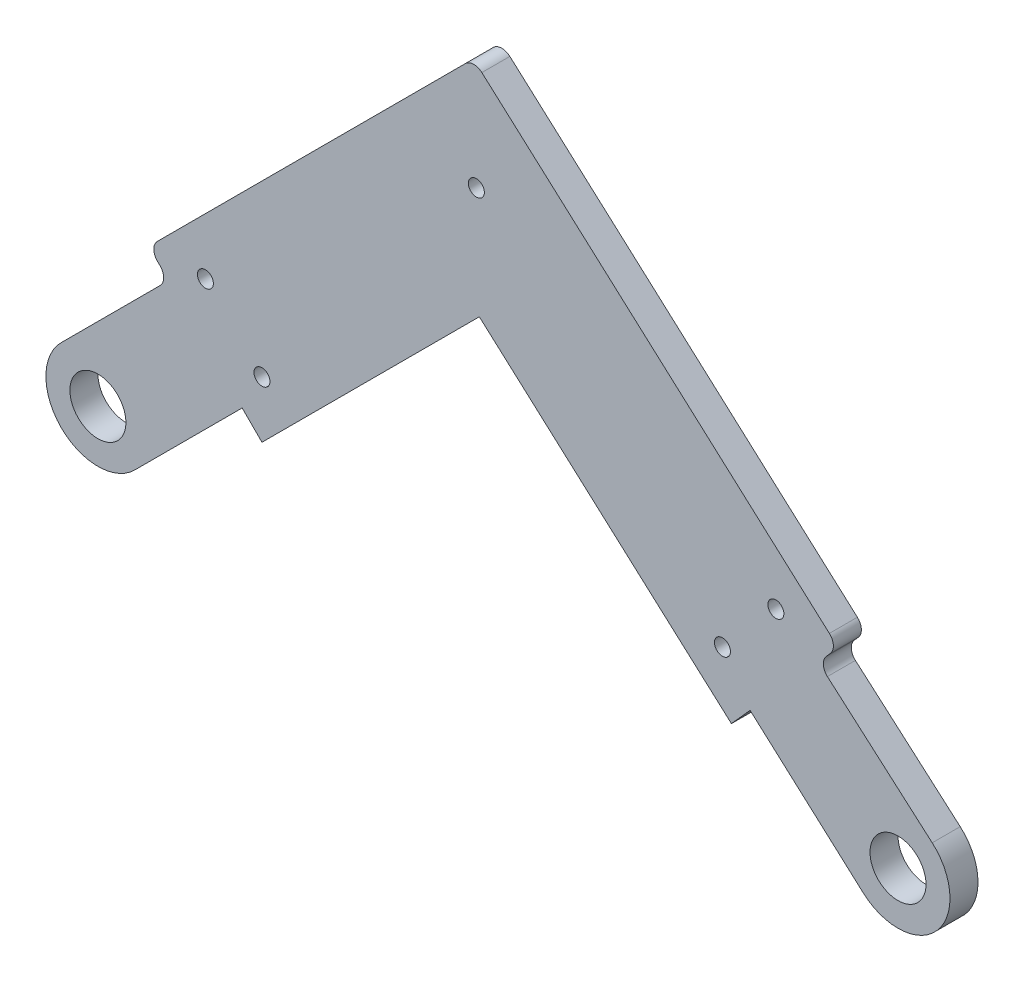
ISO-10303-21;
HEADER;
FILE_DESCRIPTION(('STEP AP214'),'2;1');
FILE_NAME('part.step','',(''),(''),'','','');
FILE_SCHEMA(('AUTOMOTIVE_DESIGN { 1 0 10303 214 1 1 1 1 }'));
ENDSEC;
DATA;
#1=APPLICATION_CONTEXT('core data for automotive mechanical design processes');
#2=APPLICATION_PROTOCOL_DEFINITION('international standard','automotive_design',2000,#1);
#3=PRODUCT_CONTEXT('',#1,'mechanical');
#4=PRODUCT('Part','Part','',(#3));
#5=PRODUCT_RELATED_PRODUCT_CATEGORY('part','',(#4));
#6=PRODUCT_DEFINITION_FORMATION('','',#4);
#7=PRODUCT_DEFINITION_CONTEXT('part definition',#1,'design');
#8=PRODUCT_DEFINITION('design','',#6,#7);
#9=PRODUCT_DEFINITION_SHAPE('','',#8);
#10=(LENGTH_UNIT() NAMED_UNIT(*) SI_UNIT(.MILLI.,.METRE.));
#11=(NAMED_UNIT(*) PLANE_ANGLE_UNIT() SI_UNIT($,.RADIAN.));
#12=(NAMED_UNIT(*) SI_UNIT($,.STERADIAN.) SOLID_ANGLE_UNIT());
#13=UNCERTAINTY_MEASURE_WITH_UNIT(LENGTH_MEASURE(1.E-05),#10,'distance_accuracy_value','');
#14=(GEOMETRIC_REPRESENTATION_CONTEXT(3) GLOBAL_UNCERTAINTY_ASSIGNED_CONTEXT((#13)) GLOBAL_UNIT_ASSIGNED_CONTEXT((#10,
#11,#12)) REPRESENTATION_CONTEXT('',''));
#15=CARTESIAN_POINT('',(0.,0.,0.));
#16=DIRECTION('',(0.,0.,1.));
#17=DIRECTION('',(1.,0.,0.));
#18=AXIS2_PLACEMENT_3D('',#15,#16,#17);
#19=CARTESIAN_POINT('',(-4.34175774479253,-4.83726572409805,3.5));
#20=DIRECTION('',(0.667962729968083,0.744194726784318,0.));
#21=DIRECTION('',(-0.744194726784318,0.667962729968083,0.));
#22=AXIS2_PLACEMENT_3D('',#19,#20,#21);
#23=PLANE('',#22);
#24=DIRECTION('',(0.744194726784318,-0.667962729968083,0.));
#25=VECTOR('',#24,1.);
#26=CARTESIAN_POINT('',(-4.34175774479253,-4.83726572409805,0.));
#27=LINE('',#26,#25);
#28=CARTESIAN_POINT('',(-18.4814575536946,7.85402614529553,0.));
#29=VERTEX_POINT('',#28);
#30=CARTESIAN_POINT('',(-4.34175774479254,-4.83726572409804,0.));
#31=VERTEX_POINT('',#30);
#32=EDGE_CURVE('E194',#29,#31,#27,.T.);
#33=ORIENTED_EDGE('',*,*,#32,.T.);
#34=DIRECTION('',(0.,0.,-1.));
#35=VECTOR('',#34,1.);
#36=CARTESIAN_POINT('',(-4.34175774479254,-4.83726572409804,3.5));
#37=LINE('',#36,#35);
#38=CARTESIAN_POINT('',(-4.34175774479254,-4.83726572409804,3.5));
#39=VERTEX_POINT('',#38);
#40=EDGE_CURVE('E175',#39,#31,#37,.T.);
#41=ORIENTED_EDGE('',*,*,#40,.F.);
#42=DIRECTION('',(0.744194726784318,-0.667962729968083,0.));
#43=VECTOR('',#42,1.);
#44=CARTESIAN_POINT('',(-4.34175774479253,-4.83726572409805,3.5));
#45=LINE('',#44,#43);
#46=CARTESIAN_POINT('',(-18.4814575536946,7.85402614529553,3.5));
#47=VERTEX_POINT('',#46);
#48=EDGE_CURVE('E181',#47,#39,#45,.T.);
#49=ORIENTED_EDGE('',*,*,#48,.F.);
#50=DIRECTION('',(0.,0.,-1.));
#51=VECTOR('',#50,1.);
#52=CARTESIAN_POINT('',(-18.4814575536946,7.85402614529553,3.5));
#53=LINE('',#52,#51);
#54=EDGE_CURVE('E284',#47,#29,#53,.T.);
#55=ORIENTED_EDGE('',*,*,#54,.T.);
#56=EDGE_LOOP('',(#33,#41,#49,#55));
#57=FACE_BOUND('',#56,.T.);
#58=ADVANCED_FACE('F37',(#57),#23,.F.);
#59=CARTESIAN_POINT('',(0.,0.,3.5));
#60=DIRECTION('',(0.,0.,-1.));
#61=DIRECTION('',(-1.,0.,0.));
#62=AXIS2_PLACEMENT_3D('',#59,#60,#61);
#63=CYLINDRICAL_SURFACE('',#62,6.49999999999999);
#64=CARTESIAN_POINT('',(0.,0.,0.));
#65=DIRECTION('',(0.,0.,1.));
#66=DIRECTION('',(1.,0.,0.));
#67=AXIS2_PLACEMENT_3D('',#64,#65,#66);
#68=CIRCLE('',#67,6.49999999999999);
#69=CARTESIAN_POINT('',(4.27629941300529,4.89522862901527,0.));
#70=VERTEX_POINT('',#69);
#71=EDGE_CURVE('E251',#31,#70,#68,.T.);
#72=ORIENTED_EDGE('',*,*,#71,.T.);
#73=DIRECTION('',(0.,0.,-1.));
#74=VECTOR('',#73,1.);
#75=CARTESIAN_POINT('',(4.27629941300529,4.89522862901527,3.5));
#76=LINE('',#75,#74);
#77=CARTESIAN_POINT('',(4.27629941300529,4.89522862901527,3.5));
#78=VERTEX_POINT('',#77);
#79=EDGE_CURVE('E178',#78,#70,#76,.T.);
#80=ORIENTED_EDGE('',*,*,#79,.F.);
#81=CARTESIAN_POINT('',(0.,0.,3.5));
#82=DIRECTION('',(0.,0.,1.));
#83=DIRECTION('',(1.,0.,0.));
#84=AXIS2_PLACEMENT_3D('',#81,#82,#83);
#85=CIRCLE('',#84,6.49999999999999);
#86=EDGE_CURVE('E170',#39,#78,#85,.T.);
#87=ORIENTED_EDGE('',*,*,#86,.F.);
#88=ORIENTED_EDGE('',*,*,#40,.T.);
#89=EDGE_LOOP('',(#72,#80,#87,#88));
#90=FACE_BOUND('',#89,.T.);
#91=ADVANCED_FACE('F173',(#90),#63,.T.);
#92=CARTESIAN_POINT('',(4.27629941300529,4.89522862901527,3.5));
#93=DIRECTION('',(0.657892217385429,0.753112096771578,0.));
#94=DIRECTION('',(-0.753112096771578,0.657892217385429,0.));
#95=AXIS2_PLACEMENT_3D('',#92,#93,#94);
#96=PLANE('',#95);
#97=DIRECTION('',(0.753112096771578,-0.657892217385429,0.));
#98=VECTOR('',#97,1.);
#99=CARTESIAN_POINT('',(4.27629941300529,4.89522862901527,0.));
#100=LINE('',#99,#98);
#101=CARTESIAN_POINT('',(-8.8233071244454,16.3385837799205,0.));
#102=VERTEX_POINT('',#101);
#103=EDGE_CURVE('E243',#102,#70,#100,.T.);
#104=ORIENTED_EDGE('',*,*,#103,.F.);
#105=DIRECTION('',(0.,0.,-1.));
#106=VECTOR('',#105,1.);
#107=CARTESIAN_POINT('',(-8.82330712444541,16.3385837799205,3.5));
#108=LINE('',#107,#106);
#109=CARTESIAN_POINT('',(-8.8233071244454,16.3385837799205,3.5));
#110=VERTEX_POINT('',#109);
#111=EDGE_CURVE('E229',#102,#110,#108,.F.);
#112=ORIENTED_EDGE('',*,*,#111,.T.);
#113=DIRECTION('',(0.753112096771578,-0.657892217385429,0.));
#114=VECTOR('',#113,1.);
#115=CARTESIAN_POINT('',(4.27629941300529,4.89522862901527,3.5));
#116=LINE('',#115,#114);
#117=EDGE_CURVE('E180',#110,#78,#116,.T.);
#118=ORIENTED_EDGE('',*,*,#117,.T.);
#119=ORIENTED_EDGE('',*,*,#79,.T.);
#120=EDGE_LOOP('',(#104,#112,#118,#119));
#121=FACE_BOUND('',#120,.T.);
#122=ADVANCED_FACE('F250',(#121),#96,.T.);
#123=CARTESIAN_POINT('',(-14.139699808902,12.6912918693936,3.5));
#124=DIRECTION('',(-0.744194726784317,0.667962729968084,0.));
#125=DIRECTION('',(-0.667962729968084,-0.744194726784317,0.));
#126=AXIS2_PLACEMENT_3D('',#123,#124,#125);
#127=PLANE('',#126);
#128=DIRECTION('',(0.667962729968084,0.744194726784317,0.));
#129=VECTOR('',#128,1.);
#130=CARTESIAN_POINT('',(-14.139699808902,12.6912918693936,3.5));
#131=LINE('',#130,#129);
#132=CARTESIAN_POINT('',(-8.95276088854374,18.47019602003,3.5));
#133=VERTEX_POINT('',#132);
#134=CARTESIAN_POINT('',(-8.46201660417332,19.0169470470603,3.5));
#135=VERTEX_POINT('',#134);
#136=EDGE_CURVE('E256',#133,#135,#131,.T.);
#137=ORIENTED_EDGE('',*,*,#136,.F.);
#138=DIRECTION('',(0.,0.,-1.));
#139=VECTOR('',#138,1.);
#140=CARTESIAN_POINT('',(-8.95276088854374,18.47019602003,3.5));
#141=LINE('',#140,#139);
#142=CARTESIAN_POINT('',(-8.95276088854374,18.47019602003,0.));
#143=VERTEX_POINT('',#142);
#144=EDGE_CURVE('E226',#133,#143,#141,.T.);
#145=ORIENTED_EDGE('',*,*,#144,.T.);
#146=DIRECTION('',(0.667962729968084,0.744194726784317,0.));
#147=VECTOR('',#146,1.);
#148=CARTESIAN_POINT('',(-14.139699808902,12.6912918693936,0.));
#149=LINE('',#148,#147);
#150=CARTESIAN_POINT('',(-8.46201660417332,19.0169470470603,0.));
#151=VERTEX_POINT('',#150);
#152=EDGE_CURVE('E245',#143,#151,#149,.T.);
#153=ORIENTED_EDGE('',*,*,#152,.T.);
#154=DIRECTION('',(0.,0.,-1.));
#155=VECTOR('',#154,1.);
#156=CARTESIAN_POINT('',(-8.46201660417332,19.0169470470603,3.5));
#157=LINE('',#156,#155);
#158=EDGE_CURVE('E224',#151,#135,#157,.F.);
#159=ORIENTED_EDGE('',*,*,#158,.T.);
#160=EDGE_LOOP('',(#137,#145,#153,#159));
#161=FACE_BOUND('',#160,.T.);
#162=ADVANCED_FACE('F258',(#161),#127,.F.);
#163=CARTESIAN_POINT('',(6.67962729968085,7.44194726784319,3.5));
#164=DIRECTION('',(-0.667962729968084,-0.744194726784318,0.));
#165=DIRECTION('',(0.744194726784318,-0.667962729968084,0.));
#166=AXIS2_PLACEMENT_3D('',#163,#164,#165);
#167=PLANE('',#166);
#168=DIRECTION('',(-0.744194726784318,0.667962729968084,0.));
#169=VECTOR('',#168,1.);
#170=CARTESIAN_POINT('',(6.67962729968085,7.44194726784319,3.5));
#171=LINE('',#170,#169);
#172=CARTESIAN_POINT('',(-8.57636459939768,21.1351832321889,3.5));
#173=VERTEX_POINT('',#172);
#174=CARTESIAN_POINT('',(-52.0128947699394,60.1222685054563,3.5));
#175=VERTEX_POINT('',#174);
#176=EDGE_CURVE('E260',#173,#175,#171,.T.);
#177=ORIENTED_EDGE('',*,*,#176,.F.);
#178=DIRECTION('',(0.,0.,-1.));
#179=VECTOR('',#178,1.);
#180=CARTESIAN_POINT('',(-8.57636459939768,21.1351832321889,3.5));
#181=LINE('',#180,#179);
#182=CARTESIAN_POINT('',(-8.57636459939768,21.1351832321889,0.));
#183=VERTEX_POINT('',#182);
#184=EDGE_CURVE('E232',#173,#183,#181,.T.);
#185=ORIENTED_EDGE('',*,*,#184,.T.);
#186=DIRECTION('',(-0.744194726784318,0.667962729968084,0.));
#187=VECTOR('',#186,1.);
#188=CARTESIAN_POINT('',(6.67962729968085,7.44194726784319,0.));
#189=LINE('',#188,#187);
#190=CARTESIAN_POINT('',(-52.0128947699394,60.1222685054563,0.));
#191=VERTEX_POINT('',#190);
#192=EDGE_CURVE('E309',#183,#191,#189,.T.);
#193=ORIENTED_EDGE('',*,*,#192,.T.);
#194=DIRECTION('',(0.,0.,-1.));
#195=VECTOR('',#194,1.);
#196=CARTESIAN_POINT('',(-52.0128947699394,60.1222685054563,3.5));
#197=LINE('',#196,#195);
#198=EDGE_CURVE('E52',#191,#175,#197,.F.);
#199=ORIENTED_EDGE('',*,*,#198,.T.);
#200=EDGE_LOOP('',(#177,#185,#193,#199));
#201=FACE_BOUND('',#200,.T.);
#202=ADVANCED_FACE('F387',(#201),#167,.F.);
#203=CARTESIAN_POINT('',(-57.0710678118655,57.0710678118655,3.5));
#204=DIRECTION('',(0.707106781186548,-0.707106781186547,0.));
#205=DIRECTION('',(0.707106781186547,0.707106781186548,0.));
#206=AXIS2_PLACEMENT_3D('',#203,#204,#205);
#207=PLANE('',#206);
#208=DIRECTION('',(-0.707106781186547,-0.707106781186548,0.));
#209=VECTOR('',#208,1.);
#210=CARTESIAN_POINT('',(-57.0710678118655,57.0710678118655,0.));
#211=LINE('',#210,#209);
#212=CARTESIAN_POINT('',(-54.0754990366714,60.0666365870596,0.));
#213=VERTEX_POINT('',#212);
#214=CARTESIAN_POINT('',(-92.5753787975412,21.5667568261897,0.));
#215=VERTEX_POINT('',#214);
#216=EDGE_CURVE('E311',#213,#215,#211,.T.);
#217=ORIENTED_EDGE('',*,*,#216,.T.);
#218=DIRECTION('',(0.,0.,-1.));
#219=VECTOR('',#218,1.);
#220=CARTESIAN_POINT('',(-92.5753787975412,21.5667568261897,3.5));
#221=LINE('',#220,#219);
#222=CARTESIAN_POINT('',(-92.5753787975412,21.5667568261897,3.5));
#223=VERTEX_POINT('',#222);
#224=EDGE_CURVE('E217',#215,#223,#221,.F.);
#225=ORIENTED_EDGE('',*,*,#224,.T.);
#226=DIRECTION('',(-0.707106781186547,-0.707106781186548,0.));
#227=VECTOR('',#226,1.);
#228=CARTESIAN_POINT('',(-57.0710678118655,57.0710678118655,3.5));
#229=LINE('',#228,#227);
#230=CARTESIAN_POINT('',(-54.0754990366714,60.0666365870596,3.5));
#231=VERTEX_POINT('',#230);
#232=EDGE_CURVE('E262',#231,#223,#229,.T.);
#233=ORIENTED_EDGE('',*,*,#232,.F.);
#234=DIRECTION('',(0.,0.,-1.));
#235=VECTOR('',#234,1.);
#236=CARTESIAN_POINT('',(-54.0754990366714,60.0666365870596,3.5));
#237=LINE('',#236,#235);
#238=EDGE_CURVE('E214',#231,#213,#237,.T.);
#239=ORIENTED_EDGE('',*,*,#238,.T.);
#240=EDGE_LOOP('',(#217,#225,#233,#239));
#241=FACE_BOUND('',#240,.T.);
#242=ADVANCED_FACE('F381',(#241),#207,.F.);
#243=CARTESIAN_POINT('',(-36.5649711574555,-36.5649711574556,3.5));
#244=DIRECTION('',(0.707106781186547,0.707106781186548,0.));
#245=DIRECTION('',(-0.707106781186548,0.707106781186547,0.));
#246=AXIS2_PLACEMENT_3D('',#243,#244,#245);
#247=PLANE('',#246);
#248=DIRECTION('',(0.707106781186548,-0.707106781186547,0.));
#249=VECTOR('',#248,1.);
#250=CARTESIAN_POINT('',(-36.5649711574555,-36.5649711574556,0.));
#251=LINE('',#250,#249);
#252=CARTESIAN_POINT('',(-92.5753787975412,19.44543648263,0.));
#253=VERTEX_POINT('',#252);
#254=CARTESIAN_POINT('',(-92.221825406948,19.0918830920368,0.));
#255=VERTEX_POINT('',#254);
#256=EDGE_CURVE('E314',#253,#255,#251,.T.);
#257=ORIENTED_EDGE('',*,*,#256,.T.);
#258=DIRECTION('',(0.,0.,-1.));
#259=VECTOR('',#258,1.);
#260=CARTESIAN_POINT('',(-92.221825406948,19.0918830920368,3.5));
#261=LINE('',#260,#259);
#262=CARTESIAN_POINT('',(-92.221825406948,19.0918830920368,3.5));
#263=VERTEX_POINT('',#262);
#264=EDGE_CURVE('E206',#255,#263,#261,.F.);
#265=ORIENTED_EDGE('',*,*,#264,.T.);
#266=DIRECTION('',(0.707106781186548,-0.707106781186547,0.));
#267=VECTOR('',#266,1.);
#268=CARTESIAN_POINT('',(-36.5649711574555,-36.5649711574556,3.5));
#269=LINE('',#268,#267);
#270=CARTESIAN_POINT('',(-92.5753787975412,19.44543648263,3.5));
#271=VERTEX_POINT('',#270);
#272=EDGE_CURVE('E267',#271,#263,#269,.T.);
#273=ORIENTED_EDGE('',*,*,#272,.F.);
#274=DIRECTION('',(0.,0.,-1.));
#275=VECTOR('',#274,1.);
#276=CARTESIAN_POINT('',(-92.5753787975412,19.44543648263,3.5));
#277=LINE('',#276,#275);
#278=EDGE_CURVE('E198',#271,#253,#277,.T.);
#279=ORIENTED_EDGE('',*,*,#278,.T.);
#280=EDGE_LOOP('',(#257,#265,#273,#279));
#281=FACE_BOUND('',#280,.T.);
#282=ADVANCED_FACE('F372',(#281),#247,.F.);
#283=CARTESIAN_POINT('',(-54.5961940777126,54.5961940777126,3.5));
#284=DIRECTION('',(0.707106781186548,-0.707106781186547,0.));
#285=DIRECTION('',(0.707106781186547,0.707106781186548,0.));
#286=AXIS2_PLACEMENT_3D('',#283,#284,#285);
#287=PLANE('',#286);
#288=DIRECTION('',(-0.707106781186547,-0.707106781186548,0.));
#289=VECTOR('',#288,1.);
#290=CARTESIAN_POINT('',(-54.5961940777126,54.5961940777126,3.5));
#291=LINE('',#290,#289);
#292=CARTESIAN_POINT('',(-92.221825406948,16.9705627484771,3.5));
#293=VERTEX_POINT('',#292);
#294=CARTESIAN_POINT('',(-104.596194077713,4.59619407771256,3.5));
#295=VERTEX_POINT('',#294);
#296=EDGE_CURVE('E270',#293,#295,#291,.T.);
#297=ORIENTED_EDGE('',*,*,#296,.F.);
#298=DIRECTION('',(0.,0.,-1.));
#299=VECTOR('',#298,1.);
#300=CARTESIAN_POINT('',(-92.221825406948,16.9705627484771,0.));
#301=LINE('',#300,#299);
#302=CARTESIAN_POINT('',(-92.221825406948,16.9705627484771,0.));
#303=VERTEX_POINT('',#302);
#304=EDGE_CURVE('E195',#293,#303,#301,.T.);
#305=ORIENTED_EDGE('',*,*,#304,.T.);
#306=DIRECTION('',(-0.707106781186547,-0.707106781186548,0.));
#307=VECTOR('',#306,1.);
#308=CARTESIAN_POINT('',(-54.5961940777126,54.5961940777126,0.));
#309=LINE('',#308,#307);
#310=CARTESIAN_POINT('',(-104.596194077713,4.59619407771256,0.));
#311=VERTEX_POINT('',#310);
#312=EDGE_CURVE('E317',#303,#311,#309,.T.);
#313=ORIENTED_EDGE('',*,*,#312,.T.);
#314=DIRECTION('',(0.,0.,-1.));
#315=VECTOR('',#314,1.);
#316=CARTESIAN_POINT('',(-104.596194077713,4.59619407771256,3.5));
#317=LINE('',#316,#315);
#318=EDGE_CURVE('E200',#295,#311,#317,.T.);
#319=ORIENTED_EDGE('',*,*,#318,.F.);
#320=EDGE_LOOP('',(#297,#305,#313,#319));
#321=FACE_BOUND('',#320,.T.);
#322=ADVANCED_FACE('F367',(#321),#287,.F.);
#323=CARTESIAN_POINT('',(-100.,0.,3.5));
#324=DIRECTION('',(0.,0.,-1.));
#325=DIRECTION('',(-1.,0.,0.));
#326=AXIS2_PLACEMENT_3D('',#323,#324,#325);
#327=CYLINDRICAL_SURFACE('',#326,6.5);
#328=CARTESIAN_POINT('',(-100.,0.,0.));
#329=DIRECTION('',(0.,0.,1.));
#330=DIRECTION('',(1.,0.,0.));
#331=AXIS2_PLACEMENT_3D('',#328,#329,#330);
#332=CIRCLE('',#331,6.5);
#333=CARTESIAN_POINT('',(-95.4038059222874,-4.59619407771256,0.));
#334=VERTEX_POINT('',#333);
#335=EDGE_CURVE('E319',#311,#334,#332,.T.);
#336=ORIENTED_EDGE('',*,*,#335,.T.);
#337=DIRECTION('',(0.,0.,-1.));
#338=VECTOR('',#337,1.);
#339=CARTESIAN_POINT('',(-95.4038059222874,-4.59619407771256,3.5));
#340=LINE('',#339,#338);
#341=CARTESIAN_POINT('',(-95.4038059222874,-4.59619407771256,3.5));
#342=VERTEX_POINT('',#341);
#343=EDGE_CURVE('E346',#342,#334,#340,.T.);
#344=ORIENTED_EDGE('',*,*,#343,.F.);
#345=CARTESIAN_POINT('',(-100.,0.,3.5));
#346=DIRECTION('',(0.,0.,1.));
#347=DIRECTION('',(1.,0.,0.));
#348=AXIS2_PLACEMENT_3D('',#345,#346,#347);
#349=CIRCLE('',#348,6.5);
#350=EDGE_CURVE('E272',#295,#342,#349,.T.);
#351=ORIENTED_EDGE('',*,*,#350,.F.);
#352=ORIENTED_EDGE('',*,*,#318,.T.);
#353=EDGE_LOOP('',(#336,#344,#351,#352));
#354=FACE_BOUND('',#353,.T.);
#355=ADVANCED_FACE('F352',(#354),#327,.T.);
#356=CARTESIAN_POINT('',(-45.4038059222874,45.4038059222874,3.5));
#357=DIRECTION('',(0.707106781186547,-0.707106781186547,0.));
#358=DIRECTION('',(0.707106781186548,0.707106781186548,0.));
#359=AXIS2_PLACEMENT_3D('',#356,#357,#358);
#360=PLANE('',#359);
#361=DIRECTION('',(-0.707106781186548,-0.707106781186548,0.));
#362=VECTOR('',#361,1.);
#363=CARTESIAN_POINT('',(-45.4038059222874,45.4038059222874,0.));
#364=LINE('',#363,#362);
#365=CARTESIAN_POINT('',(-81.968777079743,8.83883476483184,0.));
#366=VERTEX_POINT('',#365);
#367=EDGE_CURVE('E322',#366,#334,#364,.T.);
#368=ORIENTED_EDGE('',*,*,#367,.F.);
#369=DIRECTION('',(0.,0.,-1.));
#370=VECTOR('',#369,1.);
#371=CARTESIAN_POINT('',(-81.968777079743,8.83883476483184,3.5));
#372=LINE('',#371,#370);
#373=CARTESIAN_POINT('',(-81.968777079743,8.83883476483184,3.5));
#374=VERTEX_POINT('',#373);
#375=EDGE_CURVE('E344',#374,#366,#372,.T.);
#376=ORIENTED_EDGE('',*,*,#375,.F.);
#377=DIRECTION('',(-0.707106781186548,-0.707106781186548,0.));
#378=VECTOR('',#377,1.);
#379=CARTESIAN_POINT('',(-45.4038059222874,45.4038059222874,3.5));
#380=LINE('',#379,#378);
#381=EDGE_CURVE('E274',#374,#342,#380,.T.);
#382=ORIENTED_EDGE('',*,*,#381,.T.);
#383=ORIENTED_EDGE('',*,*,#343,.T.);
#384=EDGE_LOOP('',(#368,#376,#382,#383));
#385=FACE_BOUND('',#384,.T.);
#386=ADVANCED_FACE('F361',(#385),#360,.T.);
#387=CARTESIAN_POINT('',(-36.5649711574557,-36.5649711574556,3.5));
#388=DIRECTION('',(0.707106781186548,0.707106781186547,0.));
#389=DIRECTION('',(-0.707106781186547,0.707106781186548,0.));
#390=AXIS2_PLACEMENT_3D('',#387,#388,#389);
#391=PLANE('',#390);
#392=DIRECTION('',(0.707106781186547,-0.707106781186548,0.));
#393=VECTOR('',#392,1.);
#394=CARTESIAN_POINT('',(-36.5649711574557,-36.5649711574556,0.));
#395=LINE('',#394,#393);
#396=CARTESIAN_POINT('',(-79.4939033455901,6.36396103067893,0.));
#397=VERTEX_POINT('',#396);
#398=EDGE_CURVE('E325',#366,#397,#395,.T.);
#399=ORIENTED_EDGE('',*,*,#398,.T.);
#400=DIRECTION('',(0.,0.,-1.));
#401=VECTOR('',#400,1.);
#402=CARTESIAN_POINT('',(-79.4939033455901,6.36396103067893,3.5));
#403=LINE('',#402,#401);
#404=CARTESIAN_POINT('',(-79.4939033455901,6.36396103067893,3.5));
#405=VERTEX_POINT('',#404);
#406=EDGE_CURVE('E341',#405,#397,#403,.T.);
#407=ORIENTED_EDGE('',*,*,#406,.F.);
#408=DIRECTION('',(0.707106781186547,-0.707106781186548,0.));
#409=VECTOR('',#408,1.);
#410=CARTESIAN_POINT('',(-36.5649711574557,-36.5649711574556,3.5));
#411=LINE('',#410,#409);
#412=EDGE_CURVE('E277',#374,#405,#411,.T.);
#413=ORIENTED_EDGE('',*,*,#412,.F.);
#414=ORIENTED_EDGE('',*,*,#375,.T.);
#415=EDGE_LOOP('',(#399,#407,#413,#414));
#416=FACE_BOUND('',#415,.T.);
#417=ADVANCED_FACE('F554',(#416),#391,.F.);
#418=CARTESIAN_POINT('',(-42.9289321881346,42.9289321881345,3.5));
#419=DIRECTION('',(-0.707106781186548,0.707106781186547,0.));
#420=DIRECTION('',(-0.707106781186547,-0.707106781186548,0.));
#421=AXIS2_PLACEMENT_3D('',#418,#419,#420);
#422=PLANE('',#421);
#423=DIRECTION('',(0.707106781186547,0.707106781186548,0.));
#424=VECTOR('',#423,1.);
#425=CARTESIAN_POINT('',(-42.9289321881346,42.9289321881345,0.));
#426=LINE('',#425,#424);
#427=CARTESIAN_POINT('',(-52.32771286831,33.5301515079591,0.));
#428=VERTEX_POINT('',#427);
#429=EDGE_CURVE('E327',#397,#428,#426,.T.);
#430=ORIENTED_EDGE('',*,*,#429,.T.);
#431=DIRECTION('',(0.,0.,-1.));
#432=VECTOR('',#431,1.);
#433=CARTESIAN_POINT('',(-52.32771286831,33.5301515079591,3.5));
#434=LINE('',#433,#432);
#435=CARTESIAN_POINT('',(-52.32771286831,33.5301515079591,3.5));
#436=VERTEX_POINT('',#435);
#437=EDGE_CURVE('E338',#436,#428,#434,.T.);
#438=ORIENTED_EDGE('',*,*,#437,.F.);
#439=DIRECTION('',(0.707106781186547,0.707106781186548,0.));
#440=VECTOR('',#439,1.);
#441=CARTESIAN_POINT('',(-42.9289321881346,42.9289321881345,3.5));
#442=LINE('',#441,#440);
#443=EDGE_CURVE('E279',#405,#436,#442,.T.);
#444=ORIENTED_EDGE('',*,*,#443,.F.);
#445=ORIENTED_EDGE('',*,*,#406,.T.);
#446=EDGE_LOOP('',(#430,#438,#444,#445));
#447=FACE_BOUND('',#446,.T.);
#448=ADVANCED_FACE('F546',(#447),#422,.F.);
#449=CARTESIAN_POINT('',(-6.67962729968082,-7.44194726784316,3.5));
#450=DIRECTION('',(0.667962729968084,0.744194726784318,0.));
#451=DIRECTION('',(-0.744194726784318,0.667962729968084,0.));
#452=AXIS2_PLACEMENT_3D('',#449,#450,#451);
#453=PLANE('',#452);
#454=DIRECTION('',(0.744194726784318,-0.667962729968084,0.));
#455=VECTOR('',#454,1.);
#456=CARTESIAN_POINT('',(-6.67962729968082,-7.44194726784316,0.));
#457=LINE('',#456,#455);
#458=CARTESIAN_POINT('',(-20.8193271085829,5.24934460155045,0.));
#459=VERTEX_POINT('',#458);
#460=EDGE_CURVE('E329',#428,#459,#457,.T.);
#461=ORIENTED_EDGE('',*,*,#460,.T.);
#462=DIRECTION('',(0.,0.,-1.));
#463=VECTOR('',#462,1.);
#464=CARTESIAN_POINT('',(-20.8193271085829,5.24934460155045,3.5));
#465=LINE('',#464,#463);
#466=CARTESIAN_POINT('',(-20.8193271085829,5.24934460155045,3.5));
#467=VERTEX_POINT('',#466);
#468=EDGE_CURVE('E335',#467,#459,#465,.T.);
#469=ORIENTED_EDGE('',*,*,#468,.F.);
#470=DIRECTION('',(0.744194726784318,-0.667962729968084,0.));
#471=VECTOR('',#470,1.);
#472=CARTESIAN_POINT('',(-6.67962729968082,-7.44194726784316,3.5));
#473=LINE('',#472,#471);
#474=EDGE_CURVE('E281',#436,#467,#473,.T.);
#475=ORIENTED_EDGE('',*,*,#474,.F.);
#476=ORIENTED_EDGE('',*,*,#437,.T.);
#477=EDGE_LOOP('',(#461,#469,#475,#476));
#478=FACE_BOUND('',#477,.T.);
#479=ADVANCED_FACE('F409',(#478),#453,.F.);
#480=CARTESIAN_POINT('',(-79.4939033455901,13.4350288425444,3.5));
#481=DIRECTION('',(0.,0.,-1.));
#482=DIRECTION('',(-1.,0.,0.));
#483=AXIS2_PLACEMENT_3D('',#480,#481,#482);
#484=CYLINDRICAL_SURFACE('',#483,0.999999999999998);
#485=CARTESIAN_POINT('',(-79.4939033455901,13.4350288425444,3.5));
#486=DIRECTION('',(0.,0.,1.));
#487=DIRECTION('',(1.,0.,0.));
#488=AXIS2_PLACEMENT_3D('',#485,#486,#487);
#489=CIRCLE('',#488,0.999999999999998);
#490=CARTESIAN_POINT('',(-78.4939033455901,13.4350288425444,3.5));
#491=VERTEX_POINT('',#490);
#492=EDGE_CURVE('E191',#491,#491,#489,.T.);
#493=ORIENTED_EDGE('',*,*,#492,.T.);
#494=EDGE_LOOP('',(#493));
#495=FACE_BOUND('',#494,.T.);
#496=CARTESIAN_POINT('',(-79.4939033455901,13.4350288425444,0.));
#497=DIRECTION('',(0.,0.,1.));
#498=DIRECTION('',(1.,0.,0.));
#499=AXIS2_PLACEMENT_3D('',#496,#497,#498);
#500=CIRCLE('',#499,0.999999999999998);
#501=CARTESIAN_POINT('',(-78.4939033455901,13.4350288425444,0.));
#502=VERTEX_POINT('',#501);
#503=EDGE_CURVE('E303',#502,#502,#500,.T.);
#504=ORIENTED_EDGE('',*,*,#503,.F.);
#505=EDGE_LOOP('',(#504));
#506=FACE_BOUND('',#505,.T.);
#507=ADVANCED_FACE('F405',(#495,#506),#484,.F.);
#508=CARTESIAN_POINT('',(-21.9446818194484,12.9780946152805,3.5));
#509=DIRECTION('',(0.,0.,-1.));
#510=DIRECTION('',(-1.,0.,0.));
#511=AXIS2_PLACEMENT_3D('',#508,#509,#510);
#512=CYLINDRICAL_SURFACE('',#511,1.);
#513=CARTESIAN_POINT('',(-21.9446818194484,12.9780946152805,3.5));
#514=DIRECTION('',(0.,0.,1.));
#515=DIRECTION('',(1.,0.,0.));
#516=AXIS2_PLACEMENT_3D('',#513,#514,#515);
#517=CIRCLE('',#516,1.);
#518=CARTESIAN_POINT('',(-20.9446818194484,12.9780946152805,3.5));
#519=VERTEX_POINT('',#518);
#520=EDGE_CURVE('E609',#519,#519,#517,.T.);
#521=ORIENTED_EDGE('',*,*,#520,.T.);
#522=EDGE_LOOP('',(#521));
#523=FACE_BOUND('',#522,.T.);
#524=CARTESIAN_POINT('',(-21.9446818194484,12.9780946152805,0.));
#525=DIRECTION('',(0.,0.,1.));
#526=DIRECTION('',(1.,0.,0.));
#527=AXIS2_PLACEMENT_3D('',#524,#525,#526);
#528=CIRCLE('',#527,1.);
#529=CARTESIAN_POINT('',(-20.9446818194484,12.9780946152805,0.));
#530=VERTEX_POINT('',#529);
#531=EDGE_CURVE('E300',#530,#530,#528,.T.);
#532=ORIENTED_EDGE('',*,*,#531,.F.);
#533=EDGE_LOOP('',(#532));
#534=FACE_BOUND('',#533,.T.);
#535=ADVANCED_FACE('F408',(#523,#534),#512,.F.);
#536=CARTESIAN_POINT('',(-15.2650545197675,20.4200418831237,3.5));
#537=DIRECTION('',(0.,0.,-1.));
#538=DIRECTION('',(-1.,0.,0.));
#539=AXIS2_PLACEMENT_3D('',#536,#537,#538);
#540=CYLINDRICAL_SURFACE('',#539,1.);
#541=CARTESIAN_POINT('',(-15.2650545197675,20.4200418831237,3.5));
#542=DIRECTION('',(0.,0.,1.));
#543=DIRECTION('',(1.,0.,0.));
#544=AXIS2_PLACEMENT_3D('',#541,#542,#543);
#545=CIRCLE('',#544,1.);
#546=CARTESIAN_POINT('',(-14.2650545197675,20.4200418831237,3.5));
#547=VERTEX_POINT('',#546);
#548=EDGE_CURVE('E605',#547,#547,#545,.T.);
#549=ORIENTED_EDGE('',*,*,#548,.T.);
#550=EDGE_LOOP('',(#549));
#551=FACE_BOUND('',#550,.T.);
#552=CARTESIAN_POINT('',(-15.2650545197675,20.4200418831237,0.));
#553=DIRECTION('',(0.,0.,1.));
#554=DIRECTION('',(1.,0.,0.));
#555=AXIS2_PLACEMENT_3D('',#552,#553,#554);
#556=CIRCLE('',#555,1.);
#557=CARTESIAN_POINT('',(-14.2650545197675,20.4200418831237,0.));
#558=VERTEX_POINT('',#557);
#559=EDGE_CURVE('E297',#558,#558,#556,.T.);
#560=ORIENTED_EDGE('',*,*,#559,.F.);
#561=EDGE_LOOP('',(#560));
#562=FACE_BOUND('',#561,.T.);
#563=ADVANCED_FACE('F413',(#551,#562),#540,.F.);
#564=CARTESIAN_POINT('',(-86.5649711574556,20.5060966544099,3.5));
#565=DIRECTION('',(0.,0.,-1.));
#566=DIRECTION('',(-1.,0.,0.));
#567=AXIS2_PLACEMENT_3D('',#564,#565,#566);
#568=CYLINDRICAL_SURFACE('',#567,0.999999999999998);
#569=CARTESIAN_POINT('',(-86.5649711574556,20.5060966544099,3.5));
#570=DIRECTION('',(0.,0.,1.));
#571=DIRECTION('',(1.,0.,0.));
#572=AXIS2_PLACEMENT_3D('',#569,#570,#571);
#573=CIRCLE('',#572,0.999999999999998);
#574=CARTESIAN_POINT('',(-85.5649711574556,20.5060966544099,3.5));
#575=VERTEX_POINT('',#574);
#576=EDGE_CURVE('E601',#575,#575,#573,.T.);
#577=ORIENTED_EDGE('',*,*,#576,.T.);
#578=EDGE_LOOP('',(#577));
#579=FACE_BOUND('',#578,.T.);
#580=CARTESIAN_POINT('',(-86.5649711574556,20.5060966544099,0.));
#581=DIRECTION('',(0.,0.,1.));
#582=DIRECTION('',(1.,0.,0.));
#583=AXIS2_PLACEMENT_3D('',#580,#581,#582);
#584=CIRCLE('',#583,0.999999999999998);
#585=CARTESIAN_POINT('',(-85.5649711574556,20.5060966544099,0.));
#586=VERTEX_POINT('',#585);
#587=EDGE_CURVE('E294',#586,#586,#584,.T.);
#588=ORIENTED_EDGE('',*,*,#587,.F.);
#589=EDGE_LOOP('',(#588));
#590=FACE_BOUND('',#589,.T.);
#591=ADVANCED_FACE('F417',(#579,#590),#568,.F.);
#592=CARTESIAN_POINT('',(-100.,0.,3.5));
#593=DIRECTION('',(0.,0.,-1.));
#594=DIRECTION('',(-1.,0.,0.));
#595=AXIS2_PLACEMENT_3D('',#592,#593,#594);
#596=CYLINDRICAL_SURFACE('',#595,3.50000000000001);
#597=CARTESIAN_POINT('',(-100.,0.,3.5));
#598=DIRECTION('',(0.,0.,1.));
#599=DIRECTION('',(1.,0.,0.));
#600=AXIS2_PLACEMENT_3D('',#597,#598,#599);
#601=CIRCLE('',#600,3.50000000000001);
#602=CARTESIAN_POINT('',(-96.5,0.,3.5));
#603=VERTEX_POINT('',#602);
#604=EDGE_CURVE('E597',#603,#603,#601,.T.);
#605=ORIENTED_EDGE('',*,*,#604,.T.);
#606=EDGE_LOOP('',(#605));
#607=FACE_BOUND('',#606,.T.);
#608=CARTESIAN_POINT('',(-100.,0.,0.));
#609=DIRECTION('',(0.,0.,1.));
#610=DIRECTION('',(1.,0.,0.));
#611=AXIS2_PLACEMENT_3D('',#608,#609,#610);
#612=CIRCLE('',#611,3.50000000000001);
#613=CARTESIAN_POINT('',(-96.5,0.,0.));
#614=VERTEX_POINT('',#613);
#615=EDGE_CURVE('E291',#614,#614,#612,.T.);
#616=ORIENTED_EDGE('',*,*,#615,.F.);
#617=EDGE_LOOP('',(#616));
#618=FACE_BOUND('',#617,.T.);
#619=ADVANCED_FACE('F421',(#607,#618),#596,.F.);
#620=CARTESIAN_POINT('',(0.,0.,3.5));
#621=DIRECTION('',(0.,0.,-1.));
#622=DIRECTION('',(-1.,0.,0.));
#623=AXIS2_PLACEMENT_3D('',#620,#621,#622);
#624=CYLINDRICAL_SURFACE('',#623,3.5);
#625=CARTESIAN_POINT('',(0.,0.,3.5));
#626=DIRECTION('',(0.,0.,1.));
#627=DIRECTION('',(1.,0.,0.));
#628=AXIS2_PLACEMENT_3D('',#625,#626,#627);
#629=CIRCLE('',#628,3.5);
#630=CARTESIAN_POINT('',(3.5,0.,3.5));
#631=VERTEX_POINT('',#630);
#632=EDGE_CURVE('E593',#631,#631,#629,.T.);
#633=ORIENTED_EDGE('',*,*,#632,.T.);
#634=EDGE_LOOP('',(#633));
#635=FACE_BOUND('',#634,.T.);
#636=CARTESIAN_POINT('',(0.,0.,0.));
#637=DIRECTION('',(0.,0.,1.));
#638=DIRECTION('',(1.,0.,0.));
#639=AXIS2_PLACEMENT_3D('',#636,#637,#638);
#640=CIRCLE('',#639,3.5);
#641=CARTESIAN_POINT('',(3.5,0.,0.));
#642=VERTEX_POINT('',#641);
#643=EDGE_CURVE('E288',#642,#642,#640,.T.);
#644=ORIENTED_EDGE('',*,*,#643,.F.);
#645=EDGE_LOOP('',(#644));
#646=FACE_BOUND('',#645,.T.);
#647=ADVANCED_FACE('F425',(#635,#646),#624,.F.);
#648=CARTESIAN_POINT('',(-52.6991323259217,47.3008676740785,3.5));
#649=DIRECTION('',(0.,0.,-1.));
#650=DIRECTION('',(-1.,0.,0.));
#651=AXIS2_PLACEMENT_3D('',#648,#649,#650);
#652=CYLINDRICAL_SURFACE('',#651,0.999999999999998);
#653=CARTESIAN_POINT('',(-52.6991323259217,47.3008676740785,3.5));
#654=DIRECTION('',(0.,0.,1.));
#655=DIRECTION('',(1.,0.,0.));
#656=AXIS2_PLACEMENT_3D('',#653,#654,#655);
#657=CIRCLE('',#656,0.999999999999998);
#658=CARTESIAN_POINT('',(-51.6991323259217,47.3008676740785,3.5));
#659=VERTEX_POINT('',#658);
#660=EDGE_CURVE('E333',#659,#659,#657,.T.);
#661=ORIENTED_EDGE('',*,*,#660,.T.);
#662=EDGE_LOOP('',(#661));
#663=FACE_BOUND('',#662,.T.);
#664=CARTESIAN_POINT('',(-52.6991323259217,47.3008676740785,0.));
#665=DIRECTION('',(0.,0.,1.));
#666=DIRECTION('',(1.,0.,0.));
#667=AXIS2_PLACEMENT_3D('',#664,#665,#666);
#668=CIRCLE('',#667,0.999999999999998);
#669=CARTESIAN_POINT('',(-51.6991323259217,47.3008676740785,0.));
#670=VERTEX_POINT('',#669);
#671=EDGE_CURVE('E285',#670,#670,#668,.T.);
#672=ORIENTED_EDGE('',*,*,#671,.F.);
#673=EDGE_LOOP('',(#672));
#674=FACE_BOUND('',#673,.T.);
#675=ADVANCED_FACE('F429',(#663,#674),#652,.F.);
#676=CARTESIAN_POINT('',(-14.1396998089019,12.6912918693936,3.5));
#677=DIRECTION('',(-0.744194726784314,0.667962729968088,0.));
#678=DIRECTION('',(-0.667962729968088,-0.744194726784314,0.));
#679=AXIS2_PLACEMENT_3D('',#676,#677,#678);
#680=PLANE('',#679);
#681=DIRECTION('',(0.667962729968088,0.744194726784314,0.));
#682=VECTOR('',#681,1.);
#683=CARTESIAN_POINT('',(-14.1396998089019,12.6912918693936,0.));
#684=LINE('',#683,#682);
#685=EDGE_CURVE('E331',#459,#29,#684,.T.);
#686=ORIENTED_EDGE('',*,*,#685,.T.);
#687=ORIENTED_EDGE('',*,*,#54,.F.);
#688=DIRECTION('',(0.667962729968088,0.744194726784314,0.));
#689=VECTOR('',#688,1.);
#690=CARTESIAN_POINT('',(-14.1396998089019,12.6912918693936,3.5));
#691=LINE('',#690,#689);
#692=EDGE_CURVE('E187',#467,#47,#691,.T.);
#693=ORIENTED_EDGE('',*,*,#692,.F.);
#694=ORIENTED_EDGE('',*,*,#468,.T.);
#695=EDGE_LOOP('',(#686,#687,#693,#694));
#696=FACE_BOUND('',#695,.T.);
#697=ADVANCED_FACE('F433',(#696),#680,.F.);
#698=CARTESIAN_POINT('',(0.,0.,3.5));
#699=DIRECTION('',(0.,0.,1.));
#700=DIRECTION('',(1.,0.,0.));
#701=AXIS2_PLACEMENT_3D('',#698,#699,#700);
#702=PLANE('',#701);
#703=ORIENTED_EDGE('',*,*,#660,.F.);
#704=EDGE_LOOP('',(#703));
#705=FACE_BOUND('',#704,.T.);
#706=ORIENTED_EDGE('',*,*,#632,.F.);
#707=EDGE_LOOP('',(#706));
#708=FACE_BOUND('',#707,.T.);
#709=ORIENTED_EDGE('',*,*,#604,.F.);
#710=EDGE_LOOP('',(#709));
#711=FACE_BOUND('',#710,.T.);
#712=ORIENTED_EDGE('',*,*,#576,.F.);
#713=EDGE_LOOP('',(#712));
#714=FACE_BOUND('',#713,.T.);
#715=ORIENTED_EDGE('',*,*,#548,.F.);
#716=EDGE_LOOP('',(#715));
#717=FACE_BOUND('',#716,.T.);
#718=ORIENTED_EDGE('',*,*,#520,.F.);
#719=EDGE_LOOP('',(#718));
#720=FACE_BOUND('',#719,.T.);
#721=ORIENTED_EDGE('',*,*,#492,.F.);
#722=EDGE_LOOP('',(#721));
#723=FACE_BOUND('',#722,.T.);
#724=ORIENTED_EDGE('',*,*,#232,.T.);
#725=CARTESIAN_POINT('',(-91.5147186257614,20.5060966544099,3.5));
#726=DIRECTION('',(0.,0.,1.));
#727=DIRECTION('',(1.,0.,0.));
#728=AXIS2_PLACEMENT_3D('',#725,#726,#727);
#729=CIRCLE('',#728,1.5);
#730=EDGE_CURVE('E222',#223,#271,#729,.T.);
#731=ORIENTED_EDGE('',*,*,#730,.T.);
#732=ORIENTED_EDGE('',*,*,#272,.T.);
#733=CARTESIAN_POINT('',(-93.2824855787278,18.031222920257,3.5));
#734=DIRECTION('',(0.,0.,1.));
#735=DIRECTION('',(1.,0.,0.));
#736=AXIS2_PLACEMENT_3D('',#733,#734,#735);
#737=CIRCLE('',#736,1.5);
#738=EDGE_CURVE('E237',#263,#293,#737,.F.);
#739=ORIENTED_EDGE('',*,*,#738,.T.);
#740=ORIENTED_EDGE('',*,*,#296,.T.);
#741=ORIENTED_EDGE('',*,*,#350,.T.);
#742=ORIENTED_EDGE('',*,*,#381,.F.);
#743=ORIENTED_EDGE('',*,*,#412,.T.);
#744=ORIENTED_EDGE('',*,*,#443,.T.);
#745=ORIENTED_EDGE('',*,*,#474,.T.);
#746=ORIENTED_EDGE('',*,*,#692,.T.);
#747=ORIENTED_EDGE('',*,*,#48,.T.);
#748=ORIENTED_EDGE('',*,*,#86,.T.);
#749=ORIENTED_EDGE('',*,*,#117,.F.);
#750=CARTESIAN_POINT('',(-7.83646879836726,17.4682519250779,3.5));
#751=DIRECTION('',(0.,0.,1.));
#752=DIRECTION('',(1.,0.,0.));
#753=AXIS2_PLACEMENT_3D('',#750,#751,#752);
#754=CIRCLE('',#753,1.5);
#755=EDGE_CURVE('E11',#110,#133,#754,.F.);
#756=ORIENTED_EDGE('',*,*,#755,.T.);
#757=ORIENTED_EDGE('',*,*,#136,.T.);
#758=CARTESIAN_POINT('',(-9.5783086943498,20.0188911420124,3.5));
#759=DIRECTION('',(0.,0.,1.));
#760=DIRECTION('',(1.,0.,0.));
#761=AXIS2_PLACEMENT_3D('',#758,#759,#760);
#762=CIRCLE('',#761,1.5);
#763=EDGE_CURVE('E59',#135,#173,#762,.T.);
#764=ORIENTED_EDGE('',*,*,#763,.T.);
#765=ORIENTED_EDGE('',*,*,#176,.T.);
#766=CARTESIAN_POINT('',(-53.0148388648916,59.0059764152798,3.5));
#767=DIRECTION('',(0.,0.,1.));
#768=DIRECTION('',(1.,0.,0.));
#769=AXIS2_PLACEMENT_3D('',#766,#767,#768);
#770=CIRCLE('',#769,1.5);
#771=EDGE_CURVE('E219',#175,#231,#770,.T.);
#772=ORIENTED_EDGE('',*,*,#771,.T.);
#773=EDGE_LOOP('',(#724,#731,#732,#739,#740,#741,#742,#743,#744,#745,#746,#747,#748,#749,#756,
#757,#764,#765,#772));
#774=FACE_BOUND('',#773,.T.);
#775=ADVANCED_FACE('F185',(#705,#708,#711,#714,#717,#720,#723,#774),#702,.T.);
#776=CARTESIAN_POINT('',(0.,0.,0.));
#777=DIRECTION('',(0.,0.,1.));
#778=DIRECTION('',(1.,0.,0.));
#779=AXIS2_PLACEMENT_3D('',#776,#777,#778);
#780=PLANE('',#779);
#781=ORIENTED_EDGE('',*,*,#671,.T.);
#782=EDGE_LOOP('',(#781));
#783=FACE_BOUND('',#782,.T.);
#784=ORIENTED_EDGE('',*,*,#643,.T.);
#785=EDGE_LOOP('',(#784));
#786=FACE_BOUND('',#785,.T.);
#787=ORIENTED_EDGE('',*,*,#615,.T.);
#788=EDGE_LOOP('',(#787));
#789=FACE_BOUND('',#788,.T.);
#790=ORIENTED_EDGE('',*,*,#587,.T.);
#791=EDGE_LOOP('',(#790));
#792=FACE_BOUND('',#791,.T.);
#793=ORIENTED_EDGE('',*,*,#559,.T.);
#794=EDGE_LOOP('',(#793));
#795=FACE_BOUND('',#794,.T.);
#796=ORIENTED_EDGE('',*,*,#531,.T.);
#797=EDGE_LOOP('',(#796));
#798=FACE_BOUND('',#797,.T.);
#799=ORIENTED_EDGE('',*,*,#503,.T.);
#800=EDGE_LOOP('',(#799));
#801=FACE_BOUND('',#800,.T.);
#802=ORIENTED_EDGE('',*,*,#256,.F.);
#803=CARTESIAN_POINT('',(-91.5147186257614,20.5060966544099,0.));
#804=DIRECTION('',(0.,0.,1.));
#805=DIRECTION('',(1.,0.,0.));
#806=AXIS2_PLACEMENT_3D('',#803,#804,#805);
#807=CIRCLE('',#806,1.5);
#808=EDGE_CURVE('E212',#253,#215,#807,.F.);
#809=ORIENTED_EDGE('',*,*,#808,.T.);
#810=ORIENTED_EDGE('',*,*,#216,.F.);
#811=CARTESIAN_POINT('',(-53.0148388648916,59.0059764152798,0.));
#812=DIRECTION('',(0.,0.,1.));
#813=DIRECTION('',(1.,0.,0.));
#814=AXIS2_PLACEMENT_3D('',#811,#812,#813);
#815=CIRCLE('',#814,1.5);
#816=EDGE_CURVE('E208',#213,#191,#815,.F.);
#817=ORIENTED_EDGE('',*,*,#816,.T.);
#818=ORIENTED_EDGE('',*,*,#192,.F.);
#819=CARTESIAN_POINT('',(-9.5783086943498,20.0188911420124,0.));
#820=DIRECTION('',(0.,0.,1.));
#821=DIRECTION('',(1.,0.,0.));
#822=AXIS2_PLACEMENT_3D('',#819,#820,#821);
#823=CIRCLE('',#822,1.5);
#824=EDGE_CURVE('E210',#183,#151,#823,.F.);
#825=ORIENTED_EDGE('',*,*,#824,.T.);
#826=ORIENTED_EDGE('',*,*,#152,.F.);
#827=CARTESIAN_POINT('',(-7.83646879836726,17.4682519250779,0.));
#828=DIRECTION('',(0.,0.,1.));
#829=DIRECTION('',(1.,0.,0.));
#830=AXIS2_PLACEMENT_3D('',#827,#828,#829);
#831=CIRCLE('',#830,1.5);
#832=EDGE_CURVE('E45',#143,#102,#831,.T.);
#833=ORIENTED_EDGE('',*,*,#832,.T.);
#834=ORIENTED_EDGE('',*,*,#103,.T.);
#835=ORIENTED_EDGE('',*,*,#71,.F.);
#836=ORIENTED_EDGE('',*,*,#32,.F.);
#837=ORIENTED_EDGE('',*,*,#685,.F.);
#838=ORIENTED_EDGE('',*,*,#460,.F.);
#839=ORIENTED_EDGE('',*,*,#429,.F.);
#840=ORIENTED_EDGE('',*,*,#398,.F.);
#841=ORIENTED_EDGE('',*,*,#367,.T.);
#842=ORIENTED_EDGE('',*,*,#335,.F.);
#843=ORIENTED_EDGE('',*,*,#312,.F.);
#844=CARTESIAN_POINT('',(-93.2824855787278,18.031222920257,0.));
#845=DIRECTION('',(0.,0.,1.));
#846=DIRECTION('',(1.,0.,0.));
#847=AXIS2_PLACEMENT_3D('',#844,#845,#846);
#848=CIRCLE('',#847,1.5);
#849=EDGE_CURVE('E235',#303,#255,#848,.T.);
#850=ORIENTED_EDGE('',*,*,#849,.T.);
#851=EDGE_LOOP('',(#802,#809,#810,#817,#818,#825,#826,#833,#834,#835,#836,#837,#838,#839,#840,
#841,#842,#843,#850));
#852=FACE_BOUND('',#851,.T.);
#853=ADVANCED_FACE('F242',(#783,#786,#789,#792,#795,#798,#801,#852),#780,.F.);
#854=CARTESIAN_POINT('',(-93.2824855787278,18.031222920257,3.5));
#855=DIRECTION('',(0.,0.,1.));
#856=DIRECTION('',(1.,0.,0.));
#857=AXIS2_PLACEMENT_3D('',#854,#855,#856);
#858=CYLINDRICAL_SURFACE('',#857,1.5);
#859=ORIENTED_EDGE('',*,*,#738,.F.);
#860=ORIENTED_EDGE('',*,*,#264,.F.);
#861=ORIENTED_EDGE('',*,*,#849,.F.);
#862=ORIENTED_EDGE('',*,*,#304,.F.);
#863=EDGE_LOOP('',(#859,#860,#861,#862));
#864=FACE_BOUND('',#863,.T.);
#865=ADVANCED_FACE('F369',(#864),#858,.F.);
#866=CARTESIAN_POINT('',(-91.5147186257614,20.5060966544099,3.5));
#867=DIRECTION('',(0.,0.,-1.));
#868=DIRECTION('',(-1.,0.,0.));
#869=AXIS2_PLACEMENT_3D('',#866,#867,#868);
#870=CYLINDRICAL_SURFACE('',#869,1.5);
#871=ORIENTED_EDGE('',*,*,#730,.F.);
#872=ORIENTED_EDGE('',*,*,#224,.F.);
#873=ORIENTED_EDGE('',*,*,#808,.F.);
#874=ORIENTED_EDGE('',*,*,#278,.F.);
#875=EDGE_LOOP('',(#871,#872,#873,#874));
#876=FACE_BOUND('',#875,.T.);
#877=ADVANCED_FACE('F377',(#876),#870,.T.);
#878=CARTESIAN_POINT('',(-7.83646879836726,17.4682519250779,3.5));
#879=DIRECTION('',(0.,0.,-1.));
#880=DIRECTION('',(-1.,0.,0.));
#881=AXIS2_PLACEMENT_3D('',#878,#879,#880);
#882=CYLINDRICAL_SURFACE('',#881,1.5);
#883=ORIENTED_EDGE('',*,*,#755,.F.);
#884=ORIENTED_EDGE('',*,*,#111,.F.);
#885=ORIENTED_EDGE('',*,*,#832,.F.);
#886=ORIENTED_EDGE('',*,*,#144,.F.);
#887=EDGE_LOOP('',(#883,#884,#885,#886));
#888=FACE_BOUND('',#887,.T.);
#889=ADVANCED_FACE('F254',(#888),#882,.F.);
#890=CARTESIAN_POINT('',(-9.5783086943498,20.0188911420124,3.5));
#891=DIRECTION('',(0.,0.,-1.));
#892=DIRECTION('',(-1.,0.,0.));
#893=AXIS2_PLACEMENT_3D('',#890,#891,#892);
#894=CYLINDRICAL_SURFACE('',#893,1.5);
#895=ORIENTED_EDGE('',*,*,#763,.F.);
#896=ORIENTED_EDGE('',*,*,#158,.F.);
#897=ORIENTED_EDGE('',*,*,#824,.F.);
#898=ORIENTED_EDGE('',*,*,#184,.F.);
#899=EDGE_LOOP('',(#895,#896,#897,#898));
#900=FACE_BOUND('',#899,.T.);
#901=ADVANCED_FACE('F390',(#900),#894,.T.);
#902=CARTESIAN_POINT('',(-53.0148388648916,59.0059764152798,3.5));
#903=DIRECTION('',(0.,0.,-1.));
#904=DIRECTION('',(-1.,0.,0.));
#905=AXIS2_PLACEMENT_3D('',#902,#903,#904);
#906=CYLINDRICAL_SURFACE('',#905,1.5);
#907=ORIENTED_EDGE('',*,*,#771,.F.);
#908=ORIENTED_EDGE('',*,*,#198,.F.);
#909=ORIENTED_EDGE('',*,*,#816,.F.);
#910=ORIENTED_EDGE('',*,*,#238,.F.);
#911=EDGE_LOOP('',(#907,#908,#909,#910));
#912=FACE_BOUND('',#911,.T.);
#913=ADVANCED_FACE('F39',(#912),#906,.T.);
#914=CLOSED_SHELL('',(#58,#91,#122,#162,#202,#242,#282,#322,#355,#386,#417,#448,#479,#507,#535,
#563,#591,#619,#647,#675,#697,#775,#853,#865,#877,#889,#901,#913));
#915=MANIFOLD_SOLID_BREP('B2',#914);
#916=ADVANCED_BREP_SHAPE_REPRESENTATION('',(#18,#915),#14);
#917=SHAPE_DEFINITION_REPRESENTATION(#9,#916);
ENDSEC;
END-ISO-10303-21;
